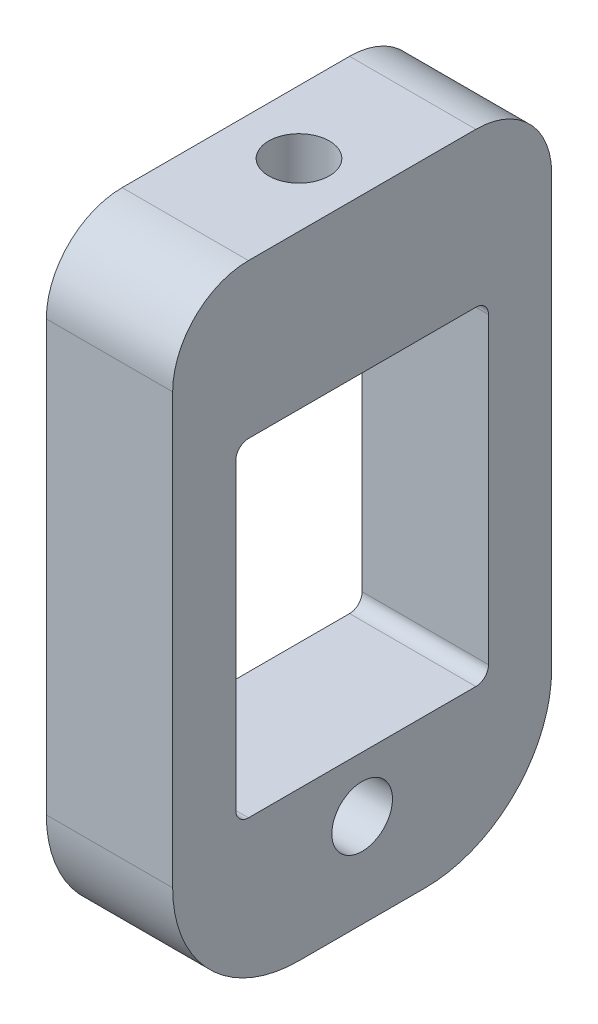
ISO-10303-21;
HEADER;
FILE_DESCRIPTION(('STEP AP214'),'2;1');
FILE_NAME('part.step','',(''),(''),'','','');
FILE_SCHEMA(('AUTOMOTIVE_DESIGN { 1 0 10303 214 1 1 1 1 }'));
ENDSEC;
DATA;
#1=APPLICATION_CONTEXT('core data for automotive mechanical design processes');
#2=APPLICATION_PROTOCOL_DEFINITION('international standard','automotive_design',2000,#1);
#3=PRODUCT_CONTEXT('',#1,'mechanical');
#4=PRODUCT('Part','Part','',(#3));
#5=PRODUCT_RELATED_PRODUCT_CATEGORY('part','',(#4));
#6=PRODUCT_DEFINITION_FORMATION('','',#4);
#7=PRODUCT_DEFINITION_CONTEXT('part definition',#1,'design');
#8=PRODUCT_DEFINITION('design','',#6,#7);
#9=PRODUCT_DEFINITION_SHAPE('','',#8);
#10=(LENGTH_UNIT() NAMED_UNIT(*) SI_UNIT(.MILLI.,.METRE.));
#11=(NAMED_UNIT(*) PLANE_ANGLE_UNIT() SI_UNIT($,.RADIAN.));
#12=(NAMED_UNIT(*) SI_UNIT($,.STERADIAN.) SOLID_ANGLE_UNIT());
#13=UNCERTAINTY_MEASURE_WITH_UNIT(LENGTH_MEASURE(1.E-05),#10,'distance_accuracy_value','');
#14=(GEOMETRIC_REPRESENTATION_CONTEXT(3) GLOBAL_UNCERTAINTY_ASSIGNED_CONTEXT((#13)) GLOBAL_UNIT_ASSIGNED_CONTEXT((#10,
#11,#12)) REPRESENTATION_CONTEXT('',''));
#15=CARTESIAN_POINT('',(0.,0.,0.));
#16=DIRECTION('',(0.,0.,1.));
#17=DIRECTION('',(1.,0.,0.));
#18=AXIS2_PLACEMENT_3D('',#15,#16,#17);
#19=CARTESIAN_POINT('',(2.5,25.,7.5));
#20=DIRECTION('',(-1.,0.,0.));
#21=DIRECTION('',(0.,0.,1.));
#22=AXIS2_PLACEMENT_3D('',#19,#20,#21);
#23=PLANE('',#22);
#24=DIRECTION('',(0.,0.,1.));
#25=VECTOR('',#24,1.);
#26=CARTESIAN_POINT('',(2.5,18.9,5.));
#27=LINE('',#26,#25);
#28=CARTESIAN_POINT('',(2.5,18.9,-4.5));
#29=VERTEX_POINT('',#28);
#30=CARTESIAN_POINT('',(2.5,18.9,4.5));
#31=VERTEX_POINT('',#30);
#32=EDGE_CURVE('E302',#29,#31,#27,.T.);
#33=ORIENTED_EDGE('',*,*,#32,.F.);
#34=CARTESIAN_POINT('',(2.5,18.4,-4.5));
#35=DIRECTION('',(-1.,0.,0.));
#36=DIRECTION('',(0.,0.,1.));
#37=AXIS2_PLACEMENT_3D('',#34,#35,#36);
#38=CIRCLE('',#37,0.5);
#39=CARTESIAN_POINT('',(2.5,18.4,-5.));
#40=VERTEX_POINT('',#39);
#41=EDGE_CURVE('E236',#29,#40,#38,.T.);
#42=ORIENTED_EDGE('',*,*,#41,.T.);
#43=DIRECTION('',(0.,1.,0.));
#44=VECTOR('',#43,1.);
#45=CARTESIAN_POINT('',(2.5,5.9,-5.));
#46=LINE('',#45,#44);
#47=CARTESIAN_POINT('',(2.5,6.4,-5.));
#48=VERTEX_POINT('',#47);
#49=EDGE_CURVE('E250',#48,#40,#46,.T.);
#50=ORIENTED_EDGE('',*,*,#49,.F.);
#51=CARTESIAN_POINT('',(2.5,6.4,-4.5));
#52=DIRECTION('',(-1.,0.,0.));
#53=DIRECTION('',(0.,0.,1.));
#54=AXIS2_PLACEMENT_3D('',#51,#52,#53);
#55=CIRCLE('',#54,0.5);
#56=CARTESIAN_POINT('',(2.5,5.9,-4.5));
#57=VERTEX_POINT('',#56);
#58=EDGE_CURVE('E239',#48,#57,#55,.T.);
#59=ORIENTED_EDGE('',*,*,#58,.T.);
#60=DIRECTION('',(0.,0.,-1.));
#61=VECTOR('',#60,1.);
#62=CARTESIAN_POINT('',(2.5,5.9,5.));
#63=LINE('',#62,#61);
#64=CARTESIAN_POINT('',(2.5,5.9,4.5));
#65=VERTEX_POINT('',#64);
#66=EDGE_CURVE('E247',#65,#57,#63,.T.);
#67=ORIENTED_EDGE('',*,*,#66,.F.);
#68=CARTESIAN_POINT('',(2.5,6.4,4.5));
#69=DIRECTION('',(-1.,0.,0.));
#70=DIRECTION('',(0.,0.,1.));
#71=AXIS2_PLACEMENT_3D('',#68,#69,#70);
#72=CIRCLE('',#71,0.5);
#73=CARTESIAN_POINT('',(2.5,6.4,5.));
#74=VERTEX_POINT('',#73);
#75=EDGE_CURVE('E11',#65,#74,#72,.T.);
#76=ORIENTED_EDGE('',*,*,#75,.T.);
#77=DIRECTION('',(0.,-1.,0.));
#78=VECTOR('',#77,1.);
#79=CARTESIAN_POINT('',(2.5,5.9,5.));
#80=LINE('',#79,#78);
#81=CARTESIAN_POINT('',(2.5,18.4,5.));
#82=VERTEX_POINT('',#81);
#83=EDGE_CURVE('E305',#82,#74,#80,.T.);
#84=ORIENTED_EDGE('',*,*,#83,.F.);
#85=CARTESIAN_POINT('',(2.5,18.4,4.5));
#86=DIRECTION('',(-1.,0.,0.));
#87=DIRECTION('',(0.,0.,1.));
#88=AXIS2_PLACEMENT_3D('',#85,#86,#87);
#89=CIRCLE('',#88,0.5);
#90=EDGE_CURVE('E232',#82,#31,#89,.T.);
#91=ORIENTED_EDGE('',*,*,#90,.T.);
#92=EDGE_LOOP('',(#33,#42,#50,#59,#67,#76,#84,#91));
#93=FACE_BOUND('',#92,.T.);
#94=CARTESIAN_POINT('',(2.5,3.7,0.));
#95=DIRECTION('',(-1.,0.,0.));
#96=DIRECTION('',(0.,0.,1.));
#97=AXIS2_PLACEMENT_3D('',#94,#95,#96);
#98=CIRCLE('',#97,1.2);
#99=CARTESIAN_POINT('',(2.5,3.7,1.2));
#100=VERTEX_POINT('',#99);
#101=EDGE_CURVE('E329',#100,#100,#98,.F.);
#102=ORIENTED_EDGE('',*,*,#101,.F.);
#103=EDGE_LOOP('',(#102));
#104=FACE_BOUND('',#103,.T.);
#105=DIRECTION('',(0.,-1.,0.));
#106=VECTOR('',#105,1.);
#107=CARTESIAN_POINT('',(2.5,25.,-7.5));
#108=LINE('',#107,#106);
#109=CARTESIAN_POINT('',(2.5,22.,-7.5));
#110=VERTEX_POINT('',#109);
#111=CARTESIAN_POINT('',(2.5,5.,-7.5));
#112=VERTEX_POINT('',#111);
#113=EDGE_CURVE('E177',#110,#112,#108,.T.);
#114=ORIENTED_EDGE('',*,*,#113,.F.);
#115=CARTESIAN_POINT('',(2.5,22.,-4.5));
#116=DIRECTION('',(-1.,0.,0.));
#117=DIRECTION('',(0.,0.,1.));
#118=AXIS2_PLACEMENT_3D('',#115,#116,#117);
#119=CIRCLE('',#118,3.);
#120=CARTESIAN_POINT('',(2.5,25.,-4.5));
#121=VERTEX_POINT('',#120);
#122=EDGE_CURVE('E207',#110,#121,#119,.F.);
#123=ORIENTED_EDGE('',*,*,#122,.T.);
#124=DIRECTION('',(0.,0.,-1.));
#125=VECTOR('',#124,1.);
#126=CARTESIAN_POINT('',(2.5,25.,7.5));
#127=LINE('',#126,#125);
#128=CARTESIAN_POINT('',(2.5,25.,4.5));
#129=VERTEX_POINT('',#128);
#130=EDGE_CURVE('E333',#129,#121,#127,.T.);
#131=ORIENTED_EDGE('',*,*,#130,.F.);
#132=CARTESIAN_POINT('',(2.5,22.,4.5));
#133=DIRECTION('',(-1.,0.,0.));
#134=DIRECTION('',(0.,0.,1.));
#135=AXIS2_PLACEMENT_3D('',#132,#133,#134);
#136=CIRCLE('',#135,3.);
#137=CARTESIAN_POINT('',(2.5,22.,7.5));
#138=VERTEX_POINT('',#137);
#139=EDGE_CURVE('E157',#129,#138,#136,.F.);
#140=ORIENTED_EDGE('',*,*,#139,.T.);
#141=DIRECTION('',(0.,-1.,0.));
#142=VECTOR('',#141,1.);
#143=CARTESIAN_POINT('',(2.5,25.,7.5));
#144=LINE('',#143,#142);
#145=CARTESIAN_POINT('',(2.5,5.,7.5));
#146=VERTEX_POINT('',#145);
#147=EDGE_CURVE('E150',#138,#146,#144,.T.);
#148=ORIENTED_EDGE('',*,*,#147,.T.);
#149=CARTESIAN_POINT('',(2.5,5.,2.5));
#150=DIRECTION('',(-1.,0.,0.));
#151=DIRECTION('',(0.,0.,1.));
#152=AXIS2_PLACEMENT_3D('',#149,#150,#151);
#153=CIRCLE('',#152,5.);
#154=CARTESIAN_POINT('',(2.5,0.,2.5));
#155=VERTEX_POINT('',#154);
#156=EDGE_CURVE('E154',#146,#155,#153,.F.);
#157=ORIENTED_EDGE('',*,*,#156,.T.);
#158=DIRECTION('',(0.,0.,-1.));
#159=VECTOR('',#158,1.);
#160=CARTESIAN_POINT('',(2.5,0.,7.5));
#161=LINE('',#160,#159);
#162=CARTESIAN_POINT('',(2.5,0.,-2.5));
#163=VERTEX_POINT('',#162);
#164=EDGE_CURVE('E332',#155,#163,#161,.T.);
#165=ORIENTED_EDGE('',*,*,#164,.T.);
#166=CARTESIAN_POINT('',(2.5,5.,-2.5));
#167=DIRECTION('',(-1.,0.,0.));
#168=DIRECTION('',(0.,0.,1.));
#169=AXIS2_PLACEMENT_3D('',#166,#167,#168);
#170=CIRCLE('',#169,5.);
#171=EDGE_CURVE('E172',#163,#112,#170,.F.);
#172=ORIENTED_EDGE('',*,*,#171,.T.);
#173=EDGE_LOOP('',(#114,#123,#131,#140,#148,#157,#165,#172));
#174=FACE_BOUND('',#173,.T.);
#175=ADVANCED_FACE('F38',(#93,#104,#174),#23,.F.);
#176=CARTESIAN_POINT('',(-2.5,25.,-7.5));
#177=DIRECTION('',(0.,0.,1.));
#178=DIRECTION('',(1.,0.,0.));
#179=AXIS2_PLACEMENT_3D('',#176,#177,#178);
#180=PLANE('',#179);
#181=DIRECTION('',(0.,-1.,0.));
#182=VECTOR('',#181,1.);
#183=CARTESIAN_POINT('',(-2.5,25.,-7.5));
#184=LINE('',#183,#182);
#185=CARTESIAN_POINT('',(-2.5,22.,-7.5));
#186=VERTEX_POINT('',#185);
#187=CARTESIAN_POINT('',(-2.5,5.,-7.5));
#188=VERTEX_POINT('',#187);
#189=EDGE_CURVE('E181',#186,#188,#184,.T.);
#190=ORIENTED_EDGE('',*,*,#189,.F.);
#191=DIRECTION('',(-1.,0.,0.));
#192=VECTOR('',#191,1.);
#193=CARTESIAN_POINT('',(-2.5,22.,-7.5));
#194=LINE('',#193,#192);
#195=EDGE_CURVE('E204',#186,#110,#194,.F.);
#196=ORIENTED_EDGE('',*,*,#195,.T.);
#197=ORIENTED_EDGE('',*,*,#113,.T.);
#198=DIRECTION('',(-1.,0.,0.));
#199=VECTOR('',#198,1.);
#200=CARTESIAN_POINT('',(-2.5,5.,-7.5));
#201=LINE('',#200,#199);
#202=EDGE_CURVE('E191',#112,#188,#201,.T.);
#203=ORIENTED_EDGE('',*,*,#202,.T.);
#204=EDGE_LOOP('',(#190,#196,#197,#203));
#205=FACE_BOUND('',#204,.T.);
#206=ADVANCED_FACE('F268',(#205),#180,.F.);
#207=CARTESIAN_POINT('',(-2.5,25.,7.5));
#208=DIRECTION('',(1.,0.,0.));
#209=DIRECTION('',(0.,0.,-1.));
#210=AXIS2_PLACEMENT_3D('',#207,#208,#209);
#211=PLANE('',#210);
#212=DIRECTION('',(0.,0.,1.));
#213=VECTOR('',#212,1.);
#214=CARTESIAN_POINT('',(-2.5,5.9,5.));
#215=LINE('',#214,#213);
#216=CARTESIAN_POINT('',(-2.5,5.9,-4.5));
#217=VERTEX_POINT('',#216);
#218=CARTESIAN_POINT('',(-2.5,5.9,4.5));
#219=VERTEX_POINT('',#218);
#220=EDGE_CURVE('E320',#217,#219,#215,.T.);
#221=ORIENTED_EDGE('',*,*,#220,.F.);
#222=CARTESIAN_POINT('',(-2.5,6.4,-4.5));
#223=DIRECTION('',(1.,0.,0.));
#224=DIRECTION('',(0.,0.,-1.));
#225=AXIS2_PLACEMENT_3D('',#222,#223,#224);
#226=CIRCLE('',#225,0.5);
#227=CARTESIAN_POINT('',(-2.5,6.4,-5.));
#228=VERTEX_POINT('',#227);
#229=EDGE_CURVE('E60',#217,#228,#226,.T.);
#230=ORIENTED_EDGE('',*,*,#229,.T.);
#231=DIRECTION('',(0.,-1.,0.));
#232=VECTOR('',#231,1.);
#233=CARTESIAN_POINT('',(-2.5,5.9,-5.));
#234=LINE('',#233,#232);
#235=CARTESIAN_POINT('',(-2.5,18.4,-5.));
#236=VERTEX_POINT('',#235);
#237=EDGE_CURVE('E317',#236,#228,#234,.T.);
#238=ORIENTED_EDGE('',*,*,#237,.F.);
#239=CARTESIAN_POINT('',(-2.5,18.4,-4.5));
#240=DIRECTION('',(1.,0.,0.));
#241=DIRECTION('',(0.,0.,-1.));
#242=AXIS2_PLACEMENT_3D('',#239,#240,#241);
#243=CIRCLE('',#242,0.5);
#244=CARTESIAN_POINT('',(-2.5,18.9,-4.5));
#245=VERTEX_POINT('',#244);
#246=EDGE_CURVE('E234',#236,#245,#243,.T.);
#247=ORIENTED_EDGE('',*,*,#246,.T.);
#248=DIRECTION('',(0.,0.,-1.));
#249=VECTOR('',#248,1.);
#250=CARTESIAN_POINT('',(-2.5,18.9,5.));
#251=LINE('',#250,#249);
#252=CARTESIAN_POINT('',(-2.5,18.9,4.5));
#253=VERTEX_POINT('',#252);
#254=EDGE_CURVE('E313',#253,#245,#251,.T.);
#255=ORIENTED_EDGE('',*,*,#254,.F.);
#256=CARTESIAN_POINT('',(-2.5,18.4,4.5));
#257=DIRECTION('',(1.,0.,0.));
#258=DIRECTION('',(0.,0.,-1.));
#259=AXIS2_PLACEMENT_3D('',#256,#257,#258);
#260=CIRCLE('',#259,0.5);
#261=CARTESIAN_POINT('',(-2.5,18.4,5.));
#262=VERTEX_POINT('',#261);
#263=EDGE_CURVE('E230',#253,#262,#260,.T.);
#264=ORIENTED_EDGE('',*,*,#263,.T.);
#265=DIRECTION('',(0.,1.,0.));
#266=VECTOR('',#265,1.);
#267=CARTESIAN_POINT('',(-2.5,5.9,5.));
#268=LINE('',#267,#266);
#269=CARTESIAN_POINT('',(-2.5,6.4,5.));
#270=VERTEX_POINT('',#269);
#271=EDGE_CURVE('E323',#270,#262,#268,.T.);
#272=ORIENTED_EDGE('',*,*,#271,.F.);
#273=CARTESIAN_POINT('',(-2.5,6.4,4.5));
#274=DIRECTION('',(1.,0.,0.));
#275=DIRECTION('',(0.,0.,-1.));
#276=AXIS2_PLACEMENT_3D('',#273,#274,#275);
#277=CIRCLE('',#276,0.5);
#278=EDGE_CURVE('E46',#270,#219,#277,.T.);
#279=ORIENTED_EDGE('',*,*,#278,.T.);
#280=EDGE_LOOP('',(#221,#230,#238,#247,#255,#264,#272,#279));
#281=FACE_BOUND('',#280,.T.);
#282=CARTESIAN_POINT('',(-2.5,3.7,0.));
#283=DIRECTION('',(-1.,0.,0.));
#284=DIRECTION('',(0.,0.,1.));
#285=AXIS2_PLACEMENT_3D('',#282,#283,#284);
#286=CIRCLE('',#285,1.2);
#287=CARTESIAN_POINT('',(-2.5,3.7,1.2));
#288=VERTEX_POINT('',#287);
#289=EDGE_CURVE('E254',#288,#288,#286,.T.);
#290=ORIENTED_EDGE('',*,*,#289,.F.);
#291=EDGE_LOOP('',(#290));
#292=FACE_BOUND('',#291,.T.);
#293=DIRECTION('',(0.,0.,1.));
#294=VECTOR('',#293,1.);
#295=CARTESIAN_POINT('',(-2.5,25.,7.5));
#296=LINE('',#295,#294);
#297=CARTESIAN_POINT('',(-2.5,25.,-4.5));
#298=VERTEX_POINT('',#297);
#299=CARTESIAN_POINT('',(-2.5,25.,4.5));
#300=VERTEX_POINT('',#299);
#301=EDGE_CURVE('E162',#298,#300,#296,.T.);
#302=ORIENTED_EDGE('',*,*,#301,.F.);
#303=CARTESIAN_POINT('',(-2.5,22.,-4.5));
#304=DIRECTION('',(1.,0.,0.));
#305=DIRECTION('',(0.,0.,-1.));
#306=AXIS2_PLACEMENT_3D('',#303,#304,#305);
#307=CIRCLE('',#306,3.);
#308=EDGE_CURVE('E202',#298,#186,#307,.F.);
#309=ORIENTED_EDGE('',*,*,#308,.T.);
#310=ORIENTED_EDGE('',*,*,#189,.T.);
#311=CARTESIAN_POINT('',(-2.5,5.,-2.5));
#312=DIRECTION('',(1.,0.,0.));
#313=DIRECTION('',(0.,0.,-1.));
#314=AXIS2_PLACEMENT_3D('',#311,#312,#313);
#315=CIRCLE('',#314,5.);
#316=CARTESIAN_POINT('',(-2.5,0.,-2.5));
#317=VERTEX_POINT('',#316);
#318=EDGE_CURVE('E187',#188,#317,#315,.F.);
#319=ORIENTED_EDGE('',*,*,#318,.T.);
#320=DIRECTION('',(0.,0.,1.));
#321=VECTOR('',#320,1.);
#322=CARTESIAN_POINT('',(-2.5,0.,7.5));
#323=LINE('',#322,#321);
#324=CARTESIAN_POINT('',(-2.5,0.,2.5));
#325=VERTEX_POINT('',#324);
#326=EDGE_CURVE('E336',#317,#325,#323,.T.);
#327=ORIENTED_EDGE('',*,*,#326,.T.);
#328=CARTESIAN_POINT('',(-2.5,5.,2.5));
#329=DIRECTION('',(1.,0.,0.));
#330=DIRECTION('',(0.,0.,-1.));
#331=AXIS2_PLACEMENT_3D('',#328,#329,#330);
#332=CIRCLE('',#331,5.);
#333=CARTESIAN_POINT('',(-2.5,5.,7.5));
#334=VERTEX_POINT('',#333);
#335=EDGE_CURVE('E189',#325,#334,#332,.F.);
#336=ORIENTED_EDGE('',*,*,#335,.T.);
#337=DIRECTION('',(0.,-1.,0.));
#338=VECTOR('',#337,1.);
#339=CARTESIAN_POINT('',(-2.5,25.,7.5));
#340=LINE('',#339,#338);
#341=CARTESIAN_POINT('',(-2.5,22.,7.5));
#342=VERTEX_POINT('',#341);
#343=EDGE_CURVE('E161',#342,#334,#340,.T.);
#344=ORIENTED_EDGE('',*,*,#343,.F.);
#345=CARTESIAN_POINT('',(-2.5,22.,4.5));
#346=DIRECTION('',(1.,0.,0.));
#347=DIRECTION('',(0.,0.,-1.));
#348=AXIS2_PLACEMENT_3D('',#345,#346,#347);
#349=CIRCLE('',#348,3.);
#350=EDGE_CURVE('E200',#342,#300,#349,.F.);
#351=ORIENTED_EDGE('',*,*,#350,.T.);
#352=EDGE_LOOP('',(#302,#309,#310,#319,#327,#336,#344,#351));
#353=FACE_BOUND('',#352,.T.);
#354=ADVANCED_FACE('F273',(#281,#292,#353),#211,.F.);
#355=CARTESIAN_POINT('',(-2.5,25.,7.5));
#356=DIRECTION('',(0.,0.,-1.));
#357=DIRECTION('',(-1.,0.,0.));
#358=AXIS2_PLACEMENT_3D('',#355,#356,#357);
#359=PLANE('',#358);
#360=ORIENTED_EDGE('',*,*,#147,.F.);
#361=DIRECTION('',(1.,0.,0.));
#362=VECTOR('',#361,1.);
#363=CARTESIAN_POINT('',(-2.5,22.,7.5));
#364=LINE('',#363,#362);
#365=EDGE_CURVE('E209',#138,#342,#364,.F.);
#366=ORIENTED_EDGE('',*,*,#365,.T.);
#367=ORIENTED_EDGE('',*,*,#343,.T.);
#368=DIRECTION('',(1.,0.,0.));
#369=VECTOR('',#368,1.);
#370=CARTESIAN_POINT('',(2.5,5.,7.5));
#371=LINE('',#370,#369);
#372=EDGE_CURVE('E169',#334,#146,#371,.T.);
#373=ORIENTED_EDGE('',*,*,#372,.T.);
#374=EDGE_LOOP('',(#360,#366,#367,#373));
#375=FACE_BOUND('',#374,.T.);
#376=ADVANCED_FACE('F174',(#375),#359,.F.);
#377=CARTESIAN_POINT('',(0.,25.,0.));
#378=DIRECTION('',(0.,-1.,0.));
#379=DIRECTION('',(0.,0.,-1.));
#380=AXIS2_PLACEMENT_3D('',#377,#378,#379);
#381=PLANE('',#380);
#382=CARTESIAN_POINT('',(0.,25.,0.));
#383=DIRECTION('',(0.,1.,0.));
#384=DIRECTION('',(0.,0.,1.));
#385=AXIS2_PLACEMENT_3D('',#382,#383,#384);
#386=CIRCLE('',#385,1.2);
#387=CARTESIAN_POINT('',(0.,25.,1.2));
#388=VERTEX_POINT('',#387);
#389=EDGE_CURVE('E406',#388,#388,#386,.T.);
#390=ORIENTED_EDGE('',*,*,#389,.F.);
#391=EDGE_LOOP('',(#390));
#392=FACE_BOUND('',#391,.T.);
#393=ORIENTED_EDGE('',*,*,#130,.T.);
#394=DIRECTION('',(-1.,0.,0.));
#395=VECTOR('',#394,1.);
#396=CARTESIAN_POINT('',(0.,25.,-4.5));
#397=LINE('',#396,#395);
#398=EDGE_CURVE('E197',#121,#298,#397,.T.);
#399=ORIENTED_EDGE('',*,*,#398,.T.);
#400=ORIENTED_EDGE('',*,*,#301,.T.);
#401=DIRECTION('',(1.,0.,0.));
#402=VECTOR('',#401,1.);
#403=CARTESIAN_POINT('',(0.,25.,4.5));
#404=LINE('',#403,#402);
#405=EDGE_CURVE('E194',#300,#129,#404,.T.);
#406=ORIENTED_EDGE('',*,*,#405,.T.);
#407=EDGE_LOOP('',(#393,#399,#400,#406));
#408=FACE_BOUND('',#407,.T.);
#409=ADVANCED_FACE('F357',(#392,#408),#381,.F.);
#410=CARTESIAN_POINT('',(0.,0.,0.));
#411=DIRECTION('',(0.,-1.,0.));
#412=DIRECTION('',(0.,0.,-1.));
#413=AXIS2_PLACEMENT_3D('',#410,#411,#412);
#414=PLANE('',#413);
#415=ORIENTED_EDGE('',*,*,#164,.F.);
#416=DIRECTION('',(1.,0.,0.));
#417=VECTOR('',#416,1.);
#418=CARTESIAN_POINT('',(-2.5,0.,2.5));
#419=LINE('',#418,#417);
#420=EDGE_CURVE('E170',#155,#325,#419,.F.);
#421=ORIENTED_EDGE('',*,*,#420,.T.);
#422=ORIENTED_EDGE('',*,*,#326,.F.);
#423=DIRECTION('',(-1.,0.,0.));
#424=VECTOR('',#423,1.);
#425=CARTESIAN_POINT('',(2.5,0.,-2.5));
#426=LINE('',#425,#424);
#427=EDGE_CURVE('E171',#317,#163,#426,.F.);
#428=ORIENTED_EDGE('',*,*,#427,.T.);
#429=EDGE_LOOP('',(#415,#421,#422,#428));
#430=FACE_BOUND('',#429,.T.);
#431=ADVANCED_FACE('F353',(#430),#414,.T.);
#432=CARTESIAN_POINT('',(5.89411254969543,3.7,0.));
#433=DIRECTION('',(-1.,0.,0.));
#434=DIRECTION('',(0.,0.,1.));
#435=AXIS2_PLACEMENT_3D('',#432,#433,#434);
#436=CYLINDRICAL_SURFACE('',#435,1.2);
#437=ORIENTED_EDGE('',*,*,#101,.T.);
#438=EDGE_LOOP('',(#437));
#439=FACE_BOUND('',#438,.T.);
#440=ORIENTED_EDGE('',*,*,#289,.T.);
#441=EDGE_LOOP('',(#440));
#442=FACE_BOUND('',#441,.T.);
#443=ADVANCED_FACE('F366',(#439,#442),#436,.F.);
#444=CARTESIAN_POINT('',(18.9012194668567,5.9,-5.));
#445=DIRECTION('',(0.,0.,-1.));
#446=DIRECTION('',(-1.,0.,0.));
#447=AXIS2_PLACEMENT_3D('',#444,#445,#446);
#448=PLANE('',#447);
#449=ORIENTED_EDGE('',*,*,#49,.T.);
#450=DIRECTION('',(-1.,0.,0.));
#451=VECTOR('',#450,1.);
#452=CARTESIAN_POINT('',(-2.5,18.4,-5.));
#453=LINE('',#452,#451);
#454=EDGE_CURVE('E223',#40,#236,#453,.T.);
#455=ORIENTED_EDGE('',*,*,#454,.T.);
#456=ORIENTED_EDGE('',*,*,#237,.T.);
#457=DIRECTION('',(-1.,0.,0.));
#458=VECTOR('',#457,1.);
#459=CARTESIAN_POINT('',(2.5,6.4,-5.));
#460=LINE('',#459,#458);
#461=EDGE_CURVE('E221',#228,#48,#460,.F.);
#462=ORIENTED_EDGE('',*,*,#461,.T.);
#463=EDGE_LOOP('',(#449,#455,#456,#462));
#464=FACE_BOUND('',#463,.T.);
#465=ADVANCED_FACE('F379',(#464),#448,.F.);
#466=CARTESIAN_POINT('',(18.9012194668567,18.9,5.));
#467=DIRECTION('',(0.,1.,0.));
#468=DIRECTION('',(0.,0.,1.));
#469=AXIS2_PLACEMENT_3D('',#466,#467,#468);
#470=PLANE('',#469);
#471=CARTESIAN_POINT('',(0.,18.9,0.));
#472=DIRECTION('',(0.,1.,0.));
#473=DIRECTION('',(0.,0.,1.));
#474=AXIS2_PLACEMENT_3D('',#471,#472,#473);
#475=CIRCLE('',#474,1.2);
#476=CARTESIAN_POINT('',(0.,18.9,1.2));
#477=VERTEX_POINT('',#476);
#478=EDGE_CURVE('E321',#477,#477,#475,.F.);
#479=ORIENTED_EDGE('',*,*,#478,.F.);
#480=EDGE_LOOP('',(#479));
#481=FACE_BOUND('',#480,.T.);
#482=ORIENTED_EDGE('',*,*,#32,.T.);
#483=DIRECTION('',(-1.,0.,0.));
#484=VECTOR('',#483,1.);
#485=CARTESIAN_POINT('',(-2.5,18.9,4.5));
#486=LINE('',#485,#484);
#487=EDGE_CURVE('E213',#31,#253,#486,.T.);
#488=ORIENTED_EDGE('',*,*,#487,.T.);
#489=ORIENTED_EDGE('',*,*,#254,.T.);
#490=DIRECTION('',(-1.,0.,0.));
#491=VECTOR('',#490,1.);
#492=CARTESIAN_POINT('',(2.5,18.9,-4.5));
#493=LINE('',#492,#491);
#494=EDGE_CURVE('E211',#245,#29,#493,.F.);
#495=ORIENTED_EDGE('',*,*,#494,.T.);
#496=EDGE_LOOP('',(#482,#488,#489,#495));
#497=FACE_BOUND('',#496,.T.);
#498=ADVANCED_FACE('F307',(#481,#497),#470,.F.);
#499=CARTESIAN_POINT('',(18.9012194668567,5.9,5.));
#500=DIRECTION('',(0.,0.,1.));
#501=DIRECTION('',(1.,0.,0.));
#502=AXIS2_PLACEMENT_3D('',#499,#500,#501);
#503=PLANE('',#502);
#504=ORIENTED_EDGE('',*,*,#271,.T.);
#505=DIRECTION('',(-1.,0.,0.));
#506=VECTOR('',#505,1.);
#507=CARTESIAN_POINT('',(2.5,18.4,5.));
#508=LINE('',#507,#506);
#509=EDGE_CURVE('E219',#262,#82,#508,.F.);
#510=ORIENTED_EDGE('',*,*,#509,.T.);
#511=ORIENTED_EDGE('',*,*,#83,.T.);
#512=DIRECTION('',(-1.,0.,0.));
#513=VECTOR('',#512,1.);
#514=CARTESIAN_POINT('',(-2.5,6.4,5.));
#515=LINE('',#514,#513);
#516=EDGE_CURVE('E216',#74,#270,#515,.T.);
#517=ORIENTED_EDGE('',*,*,#516,.T.);
#518=EDGE_LOOP('',(#504,#510,#511,#517));
#519=FACE_BOUND('',#518,.T.);
#520=ADVANCED_FACE('F389',(#519),#503,.F.);
#521=CARTESIAN_POINT('',(18.9012194668567,5.9,5.));
#522=DIRECTION('',(0.,-1.,0.));
#523=DIRECTION('',(0.,0.,-1.));
#524=AXIS2_PLACEMENT_3D('',#521,#522,#523);
#525=PLANE('',#524);
#526=ORIENTED_EDGE('',*,*,#66,.T.);
#527=DIRECTION('',(-1.,0.,0.));
#528=VECTOR('',#527,1.);
#529=CARTESIAN_POINT('',(-2.5,5.9,-4.5));
#530=LINE('',#529,#528);
#531=EDGE_CURVE('E228',#57,#217,#530,.T.);
#532=ORIENTED_EDGE('',*,*,#531,.T.);
#533=ORIENTED_EDGE('',*,*,#220,.T.);
#534=DIRECTION('',(-1.,0.,0.));
#535=VECTOR('',#534,1.);
#536=CARTESIAN_POINT('',(2.5,5.9,4.5));
#537=LINE('',#536,#535);
#538=EDGE_CURVE('E226',#219,#65,#537,.F.);
#539=ORIENTED_EDGE('',*,*,#538,.T.);
#540=EDGE_LOOP('',(#526,#532,#533,#539));
#541=FACE_BOUND('',#540,.T.);
#542=ADVANCED_FACE('F252',(#541),#525,.F.);
#543=CARTESIAN_POINT('',(0.,15.5058874503046,0.));
#544=DIRECTION('',(0.,1.,0.));
#545=DIRECTION('',(0.,0.,1.));
#546=AXIS2_PLACEMENT_3D('',#543,#544,#545);
#547=CYLINDRICAL_SURFACE('',#546,1.2);
#548=ORIENTED_EDGE('',*,*,#478,.T.);
#549=EDGE_LOOP('',(#548));
#550=FACE_BOUND('',#549,.T.);
#551=ORIENTED_EDGE('',*,*,#389,.T.);
#552=EDGE_LOOP('',(#551));
#553=FACE_BOUND('',#552,.T.);
#554=ADVANCED_FACE('F281',(#550,#553),#547,.F.);
#555=CARTESIAN_POINT('',(-2.5,5.,2.5));
#556=DIRECTION('',(-1.,0.,0.));
#557=DIRECTION('',(0.,0.,1.));
#558=AXIS2_PLACEMENT_3D('',#555,#556,#557);
#559=CYLINDRICAL_SURFACE('',#558,5.);
#560=ORIENTED_EDGE('',*,*,#335,.F.);
#561=ORIENTED_EDGE('',*,*,#420,.F.);
#562=ORIENTED_EDGE('',*,*,#156,.F.);
#563=ORIENTED_EDGE('',*,*,#372,.F.);
#564=EDGE_LOOP('',(#560,#561,#562,#563));
#565=FACE_BOUND('',#564,.T.);
#566=ADVANCED_FACE('F168',(#565),#559,.T.);
#567=CARTESIAN_POINT('',(-2.5,5.,-2.5));
#568=DIRECTION('',(1.,0.,0.));
#569=DIRECTION('',(0.,0.,-1.));
#570=AXIS2_PLACEMENT_3D('',#567,#568,#569);
#571=CYLINDRICAL_SURFACE('',#570,5.);
#572=ORIENTED_EDGE('',*,*,#171,.F.);
#573=ORIENTED_EDGE('',*,*,#427,.F.);
#574=ORIENTED_EDGE('',*,*,#318,.F.);
#575=ORIENTED_EDGE('',*,*,#202,.F.);
#576=EDGE_LOOP('',(#572,#573,#574,#575));
#577=FACE_BOUND('',#576,.T.);
#578=ADVANCED_FACE('F280',(#577),#571,.T.);
#579=CARTESIAN_POINT('',(0.,22.,-4.5));
#580=DIRECTION('',(-1.,0.,0.));
#581=DIRECTION('',(0.,0.,1.));
#582=AXIS2_PLACEMENT_3D('',#579,#580,#581);
#583=CYLINDRICAL_SURFACE('',#582,3.);
#584=ORIENTED_EDGE('',*,*,#122,.F.);
#585=ORIENTED_EDGE('',*,*,#195,.F.);
#586=ORIENTED_EDGE('',*,*,#308,.F.);
#587=ORIENTED_EDGE('',*,*,#398,.F.);
#588=EDGE_LOOP('',(#584,#585,#586,#587));
#589=FACE_BOUND('',#588,.T.);
#590=ADVANCED_FACE('F284',(#589),#583,.T.);
#591=CARTESIAN_POINT('',(0.,22.,4.5));
#592=DIRECTION('',(1.,0.,0.));
#593=DIRECTION('',(0.,0.,-1.));
#594=AXIS2_PLACEMENT_3D('',#591,#592,#593);
#595=CYLINDRICAL_SURFACE('',#594,3.);
#596=ORIENTED_EDGE('',*,*,#350,.F.);
#597=ORIENTED_EDGE('',*,*,#365,.F.);
#598=ORIENTED_EDGE('',*,*,#139,.F.);
#599=ORIENTED_EDGE('',*,*,#405,.F.);
#600=EDGE_LOOP('',(#596,#597,#598,#599));
#601=FACE_BOUND('',#600,.T.);
#602=ADVANCED_FACE('F288',(#601),#595,.T.);
#603=CARTESIAN_POINT('',(18.9012194668567,18.4,4.5));
#604=DIRECTION('',(1.,0.,0.));
#605=DIRECTION('',(0.,0.,-1.));
#606=AXIS2_PLACEMENT_3D('',#603,#604,#605);
#607=CYLINDRICAL_SURFACE('',#606,0.5);
#608=ORIENTED_EDGE('',*,*,#90,.F.);
#609=ORIENTED_EDGE('',*,*,#509,.F.);
#610=ORIENTED_EDGE('',*,*,#263,.F.);
#611=ORIENTED_EDGE('',*,*,#487,.F.);
#612=EDGE_LOOP('',(#608,#609,#610,#611));
#613=FACE_BOUND('',#612,.T.);
#614=ADVANCED_FACE('F264',(#613),#607,.F.);
#615=CARTESIAN_POINT('',(18.9012194668567,18.4,-4.5));
#616=DIRECTION('',(1.,0.,0.));
#617=DIRECTION('',(0.,0.,-1.));
#618=AXIS2_PLACEMENT_3D('',#615,#616,#617);
#619=CYLINDRICAL_SURFACE('',#618,0.5);
#620=ORIENTED_EDGE('',*,*,#41,.F.);
#621=ORIENTED_EDGE('',*,*,#494,.F.);
#622=ORIENTED_EDGE('',*,*,#246,.F.);
#623=ORIENTED_EDGE('',*,*,#454,.F.);
#624=EDGE_LOOP('',(#620,#621,#622,#623));
#625=FACE_BOUND('',#624,.T.);
#626=ADVANCED_FACE('F258',(#625),#619,.F.);
#627=CARTESIAN_POINT('',(18.9012194668567,6.4,-4.5));
#628=DIRECTION('',(1.,0.,0.));
#629=DIRECTION('',(0.,0.,-1.));
#630=AXIS2_PLACEMENT_3D('',#627,#628,#629);
#631=CYLINDRICAL_SURFACE('',#630,0.5);
#632=ORIENTED_EDGE('',*,*,#58,.F.);
#633=ORIENTED_EDGE('',*,*,#461,.F.);
#634=ORIENTED_EDGE('',*,*,#229,.F.);
#635=ORIENTED_EDGE('',*,*,#531,.F.);
#636=EDGE_LOOP('',(#632,#633,#634,#635));
#637=FACE_BOUND('',#636,.T.);
#638=ADVANCED_FACE('F256',(#637),#631,.F.);
#639=CARTESIAN_POINT('',(18.9012194668567,6.4,4.5));
#640=DIRECTION('',(1.,0.,0.));
#641=DIRECTION('',(0.,0.,-1.));
#642=AXIS2_PLACEMENT_3D('',#639,#640,#641);
#643=CYLINDRICAL_SURFACE('',#642,0.5);
#644=ORIENTED_EDGE('',*,*,#75,.F.);
#645=ORIENTED_EDGE('',*,*,#538,.F.);
#646=ORIENTED_EDGE('',*,*,#278,.F.);
#647=ORIENTED_EDGE('',*,*,#516,.F.);
#648=EDGE_LOOP('',(#644,#645,#646,#647));
#649=FACE_BOUND('',#648,.T.);
#650=ADVANCED_FACE('F40',(#649),#643,.F.);
#651=CLOSED_SHELL('',(#175,#206,#354,#376,#409,#431,#443,#465,#498,#520,#542,#554,#566,#578,
#590,#602,#614,#626,#638,#650));
#652=MANIFOLD_SOLID_BREP('B2',#651);
#653=ADVANCED_BREP_SHAPE_REPRESENTATION('',(#18,#652),#14);
#654=SHAPE_DEFINITION_REPRESENTATION(#9,#653);
ENDSEC;
END-ISO-10303-21;
